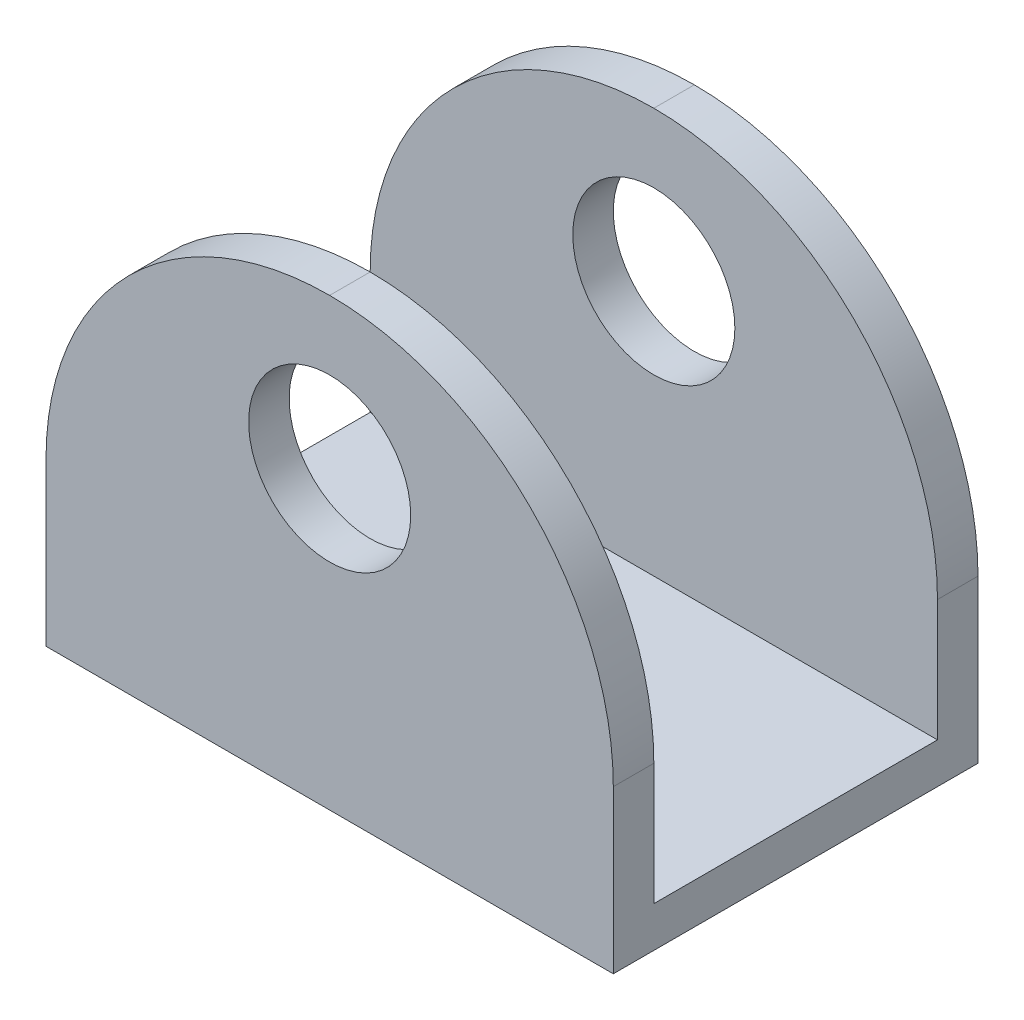
ISO-10303-21;
HEADER;
FILE_DESCRIPTION(('STEP AP214'),'2;1');
FILE_NAME('part.step','',(''),(''),'','','');
FILE_SCHEMA(('AUTOMOTIVE_DESIGN { 1 0 10303 214 1 1 1 1 }'));
ENDSEC;
DATA;
#1=APPLICATION_CONTEXT('core data for automotive mechanical design processes');
#2=APPLICATION_PROTOCOL_DEFINITION('international standard','automotive_design',2000,#1);
#3=PRODUCT_CONTEXT('',#1,'mechanical');
#4=PRODUCT('Part','Part','',(#3));
#5=PRODUCT_RELATED_PRODUCT_CATEGORY('part','',(#4));
#6=PRODUCT_DEFINITION_FORMATION('','',#4);
#7=PRODUCT_DEFINITION_CONTEXT('part definition',#1,'design');
#8=PRODUCT_DEFINITION('design','',#6,#7);
#9=PRODUCT_DEFINITION_SHAPE('','',#8);
#10=(LENGTH_UNIT() NAMED_UNIT(*) SI_UNIT(.MILLI.,.METRE.));
#11=(NAMED_UNIT(*) PLANE_ANGLE_UNIT() SI_UNIT($,.RADIAN.));
#12=(NAMED_UNIT(*) SI_UNIT($,.STERADIAN.) SOLID_ANGLE_UNIT());
#13=UNCERTAINTY_MEASURE_WITH_UNIT(LENGTH_MEASURE(1.E-05),#10,'distance_accuracy_value','');
#14=(GEOMETRIC_REPRESENTATION_CONTEXT(3) GLOBAL_UNCERTAINTY_ASSIGNED_CONTEXT((#13)) GLOBAL_UNIT_ASSIGNED_CONTEXT((#10,
#11,#12)) REPRESENTATION_CONTEXT('',''));
#15=CARTESIAN_POINT('',(0.,0.,0.));
#16=DIRECTION('',(0.,0.,1.));
#17=DIRECTION('',(1.,0.,0.));
#18=AXIS2_PLACEMENT_3D('',#15,#16,#17);
#19=CARTESIAN_POINT('',(0.,10.,0.));
#20=DIRECTION('',(0.,1.,0.));
#21=DIRECTION('',(0.,0.,1.));
#22=AXIS2_PLACEMENT_3D('',#19,#20,#21);
#23=PLANE('',#22);
#24=DIRECTION('',(0.,0.,-1.));
#25=VECTOR('',#24,1.);
#26=CARTESIAN_POINT('',(70.,10.,-45.));
#27=LINE('',#26,#25);
#28=CARTESIAN_POINT('',(70.,10.,35.));
#29=VERTEX_POINT('',#28);
#30=CARTESIAN_POINT('',(70.,10.,-35.));
#31=VERTEX_POINT('',#30);
#32=EDGE_CURVE('E117',#29,#31,#27,.T.);
#33=ORIENTED_EDGE('',*,*,#32,.T.);
#34=DIRECTION('',(1.,0.,0.));
#35=VECTOR('',#34,1.);
#36=CARTESIAN_POINT('',(70.,10.,-35.));
#37=LINE('',#36,#35);
#38=CARTESIAN_POINT('',(-70.,10.,-35.));
#39=VERTEX_POINT('',#38);
#40=EDGE_CURVE('E122',#39,#31,#37,.T.);
#41=ORIENTED_EDGE('',*,*,#40,.F.);
#42=DIRECTION('',(0.,0.,1.));
#43=VECTOR('',#42,1.);
#44=CARTESIAN_POINT('',(-70.,10.,-45.));
#45=LINE('',#44,#43);
#46=CARTESIAN_POINT('',(-70.,10.,35.));
#47=VERTEX_POINT('',#46);
#48=EDGE_CURVE('E135',#39,#47,#45,.T.);
#49=ORIENTED_EDGE('',*,*,#48,.T.);
#50=DIRECTION('',(-1.,0.,0.));
#51=VECTOR('',#50,1.);
#52=CARTESIAN_POINT('',(70.,10.,35.));
#53=LINE('',#52,#51);
#54=EDGE_CURVE('E134',#29,#47,#53,.T.);
#55=ORIENTED_EDGE('',*,*,#54,.F.);
#56=EDGE_LOOP('',(#33,#41,#49,#55));
#57=FACE_BOUND('',#56,.T.);
#58=ADVANCED_FACE('F34',(#57),#23,.T.);
#59=CARTESIAN_POINT('',(70.,10.,-45.));
#60=DIRECTION('',(-1.,0.,0.));
#61=DIRECTION('',(0.,0.,1.));
#62=AXIS2_PLACEMENT_3D('',#59,#60,#61);
#63=PLANE('',#62);
#64=DIRECTION('',(0.,-1.,0.));
#65=VECTOR('',#64,1.);
#66=CARTESIAN_POINT('',(70.,110.,35.));
#67=LINE('',#66,#65);
#68=CARTESIAN_POINT('',(70.,40.,35.));
#69=VERTEX_POINT('',#68);
#70=EDGE_CURVE('E144',#69,#29,#67,.T.);
#71=ORIENTED_EDGE('',*,*,#70,.F.);
#72=DIRECTION('',(0.,0.,-1.));
#73=VECTOR('',#72,1.);
#74=CARTESIAN_POINT('',(70.,40.,45.));
#75=LINE('',#74,#73);
#76=CARTESIAN_POINT('',(70.,40.,45.));
#77=VERTEX_POINT('',#76);
#78=EDGE_CURVE('E176',#69,#77,#75,.F.);
#79=ORIENTED_EDGE('',*,*,#78,.T.);
#80=DIRECTION('',(0.,-1.,0.));
#81=VECTOR('',#80,1.);
#82=CARTESIAN_POINT('',(70.,10.,45.));
#83=LINE('',#82,#81);
#84=CARTESIAN_POINT('',(70.,0.,45.));
#85=VERTEX_POINT('',#84);
#86=EDGE_CURVE('E138',#77,#85,#83,.T.);
#87=ORIENTED_EDGE('',*,*,#86,.T.);
#88=DIRECTION('',(0.,0.,-1.));
#89=VECTOR('',#88,1.);
#90=CARTESIAN_POINT('',(70.,0.,-45.));
#91=LINE('',#90,#89);
#92=CARTESIAN_POINT('',(70.,0.,-45.));
#93=VERTEX_POINT('',#92);
#94=EDGE_CURVE('E147',#85,#93,#91,.T.);
#95=ORIENTED_EDGE('',*,*,#94,.T.);
#96=DIRECTION('',(0.,-1.,0.));
#97=VECTOR('',#96,1.);
#98=CARTESIAN_POINT('',(70.,10.,-45.));
#99=LINE('',#98,#97);
#100=CARTESIAN_POINT('',(70.,40.,-45.));
#101=VERTEX_POINT('',#100);
#102=EDGE_CURVE('E160',#101,#93,#99,.T.);
#103=ORIENTED_EDGE('',*,*,#102,.F.);
#104=DIRECTION('',(0.,0.,-1.));
#105=VECTOR('',#104,1.);
#106=CARTESIAN_POINT('',(70.,40.,-45.));
#107=LINE('',#106,#105);
#108=CARTESIAN_POINT('',(70.,40.,-35.));
#109=VERTEX_POINT('',#108);
#110=EDGE_CURVE('E120',#101,#109,#107,.F.);
#111=ORIENTED_EDGE('',*,*,#110,.T.);
#112=DIRECTION('',(0.,-1.,0.));
#113=VECTOR('',#112,1.);
#114=CARTESIAN_POINT('',(70.,110.,-35.));
#115=LINE('',#114,#113);
#116=EDGE_CURVE('E112',#109,#31,#115,.T.);
#117=ORIENTED_EDGE('',*,*,#116,.T.);
#118=ORIENTED_EDGE('',*,*,#32,.F.);
#119=EDGE_LOOP('',(#71,#79,#87,#95,#103,#111,#117,#118));
#120=FACE_BOUND('',#119,.T.);
#121=ADVANCED_FACE('F115',(#120),#63,.F.);
#122=CARTESIAN_POINT('',(-70.,10.,-45.));
#123=DIRECTION('',(0.,0.,1.));
#124=DIRECTION('',(1.,0.,0.));
#125=AXIS2_PLACEMENT_3D('',#122,#123,#124);
#126=PLANE('',#125);
#127=CARTESIAN_POINT('',(0.,73.,-45.));
#128=DIRECTION('',(0.,0.,1.));
#129=DIRECTION('',(1.,0.,0.));
#130=AXIS2_PLACEMENT_3D('',#127,#128,#129);
#131=CIRCLE('',#130,20.);
#132=CARTESIAN_POINT('',(20.,73.,-45.));
#133=VERTEX_POINT('',#132);
#134=EDGE_CURVE('E185',#133,#133,#131,.T.);
#135=ORIENTED_EDGE('',*,*,#134,.T.);
#136=EDGE_LOOP('',(#135));
#137=FACE_BOUND('',#136,.T.);
#138=CARTESIAN_POINT('',(0.,40.,-45.));
#139=DIRECTION('',(0.,0.,1.));
#140=DIRECTION('',(1.,0.,0.));
#141=AXIS2_PLACEMENT_3D('',#138,#139,#140);
#142=CIRCLE('',#141,70.);
#143=CARTESIAN_POINT('',(-70.,40.,-45.));
#144=VERTEX_POINT('',#143);
#145=CARTESIAN_POINT('',(0.,110.,-45.));
#146=VERTEX_POINT('',#145);
#147=EDGE_CURVE('E57',#144,#146,#142,.F.);
#148=ORIENTED_EDGE('',*,*,#147,.T.);
#149=CARTESIAN_POINT('',(0.,40.,-45.));
#150=DIRECTION('',(0.,0.,1.));
#151=DIRECTION('',(1.,0.,0.));
#152=AXIS2_PLACEMENT_3D('',#149,#150,#151);
#153=CIRCLE('',#152,70.);
#154=EDGE_CURVE('E179',#146,#101,#153,.F.);
#155=ORIENTED_EDGE('',*,*,#154,.T.);
#156=ORIENTED_EDGE('',*,*,#102,.T.);
#157=DIRECTION('',(-1.,0.,0.));
#158=VECTOR('',#157,1.);
#159=CARTESIAN_POINT('',(-70.,0.,-45.));
#160=LINE('',#159,#158);
#161=CARTESIAN_POINT('',(-70.,0.,-45.));
#162=VERTEX_POINT('',#161);
#163=EDGE_CURVE('E150',#93,#162,#160,.T.);
#164=ORIENTED_EDGE('',*,*,#163,.T.);
#165=DIRECTION('',(0.,-1.,0.));
#166=VECTOR('',#165,1.);
#167=CARTESIAN_POINT('',(-70.,10.,-45.));
#168=LINE('',#167,#166);
#169=EDGE_CURVE('E158',#144,#162,#168,.T.);
#170=ORIENTED_EDGE('',*,*,#169,.F.);
#171=EDGE_LOOP('',(#148,#155,#156,#164,#170));
#172=FACE_BOUND('',#171,.T.);
#173=ADVANCED_FACE('F220',(#137,#172),#126,.F.);
#174=CARTESIAN_POINT('',(-70.,10.,-45.));
#175=DIRECTION('',(1.,0.,0.));
#176=DIRECTION('',(0.,0.,-1.));
#177=AXIS2_PLACEMENT_3D('',#174,#175,#176);
#178=PLANE('',#177);
#179=DIRECTION('',(0.,-1.,0.));
#180=VECTOR('',#179,1.);
#181=CARTESIAN_POINT('',(-70.,10.,45.));
#182=LINE('',#181,#180);
#183=CARTESIAN_POINT('',(-70.,40.,45.));
#184=VERTEX_POINT('',#183);
#185=CARTESIAN_POINT('',(-70.,0.,45.));
#186=VERTEX_POINT('',#185);
#187=EDGE_CURVE('E156',#184,#186,#182,.T.);
#188=ORIENTED_EDGE('',*,*,#187,.F.);
#189=DIRECTION('',(0.,0.,1.));
#190=VECTOR('',#189,1.);
#191=CARTESIAN_POINT('',(-70.,40.,35.));
#192=LINE('',#191,#190);
#193=CARTESIAN_POINT('',(-70.,40.,35.));
#194=VERTEX_POINT('',#193);
#195=EDGE_CURVE('E168',#184,#194,#192,.F.);
#196=ORIENTED_EDGE('',*,*,#195,.T.);
#197=DIRECTION('',(0.,-1.,0.));
#198=VECTOR('',#197,1.);
#199=CARTESIAN_POINT('',(-70.,110.,35.));
#200=LINE('',#199,#198);
#201=EDGE_CURVE('E198',#194,#47,#200,.T.);
#202=ORIENTED_EDGE('',*,*,#201,.T.);
#203=ORIENTED_EDGE('',*,*,#48,.F.);
#204=DIRECTION('',(0.,-1.,0.));
#205=VECTOR('',#204,1.);
#206=CARTESIAN_POINT('',(-70.,110.,-35.));
#207=LINE('',#206,#205);
#208=CARTESIAN_POINT('',(-70.,40.,-35.));
#209=VERTEX_POINT('',#208);
#210=EDGE_CURVE('E121',#209,#39,#207,.T.);
#211=ORIENTED_EDGE('',*,*,#210,.F.);
#212=DIRECTION('',(0.,0.,1.));
#213=VECTOR('',#212,1.);
#214=CARTESIAN_POINT('',(-70.,40.,-45.));
#215=LINE('',#214,#213);
#216=EDGE_CURVE('E166',#209,#144,#215,.F.);
#217=ORIENTED_EDGE('',*,*,#216,.T.);
#218=ORIENTED_EDGE('',*,*,#169,.T.);
#219=DIRECTION('',(0.,0.,1.));
#220=VECTOR('',#219,1.);
#221=CARTESIAN_POINT('',(-70.,0.,-45.));
#222=LINE('',#221,#220);
#223=EDGE_CURVE('E141',#162,#186,#222,.T.);
#224=ORIENTED_EDGE('',*,*,#223,.T.);
#225=EDGE_LOOP('',(#188,#196,#202,#203,#211,#217,#218,#224));
#226=FACE_BOUND('',#225,.T.);
#227=ADVANCED_FACE('F247',(#226),#178,.F.);
#228=CARTESIAN_POINT('',(-70.,10.,45.));
#229=DIRECTION('',(0.,0.,-1.));
#230=DIRECTION('',(-1.,0.,0.));
#231=AXIS2_PLACEMENT_3D('',#228,#229,#230);
#232=PLANE('',#231);
#233=CARTESIAN_POINT('',(0.,73.,45.));
#234=DIRECTION('',(0.,0.,1.));
#235=DIRECTION('',(1.,0.,0.));
#236=AXIS2_PLACEMENT_3D('',#233,#234,#235);
#237=CIRCLE('',#236,20.);
#238=CARTESIAN_POINT('',(20.,73.,45.));
#239=VERTEX_POINT('',#238);
#240=EDGE_CURVE('E266',#239,#239,#237,.T.);
#241=ORIENTED_EDGE('',*,*,#240,.F.);
#242=EDGE_LOOP('',(#241));
#243=FACE_BOUND('',#242,.T.);
#244=CARTESIAN_POINT('',(0.,40.,45.));
#245=DIRECTION('',(0.,0.,-1.));
#246=DIRECTION('',(-1.,0.,0.));
#247=AXIS2_PLACEMENT_3D('',#244,#245,#246);
#248=CIRCLE('',#247,70.);
#249=CARTESIAN_POINT('',(0.,110.,45.));
#250=VERTEX_POINT('',#249);
#251=EDGE_CURVE('E162',#77,#250,#248,.F.);
#252=ORIENTED_EDGE('',*,*,#251,.T.);
#253=CARTESIAN_POINT('',(0.,40.,45.));
#254=DIRECTION('',(0.,0.,-1.));
#255=DIRECTION('',(-1.,0.,0.));
#256=AXIS2_PLACEMENT_3D('',#253,#254,#255);
#257=CIRCLE('',#256,70.);
#258=EDGE_CURVE('E164',#250,#184,#257,.F.);
#259=ORIENTED_EDGE('',*,*,#258,.T.);
#260=ORIENTED_EDGE('',*,*,#187,.T.);
#261=DIRECTION('',(1.,0.,0.));
#262=VECTOR('',#261,1.);
#263=CARTESIAN_POINT('',(-70.,0.,45.));
#264=LINE('',#263,#262);
#265=EDGE_CURVE('E136',#186,#85,#264,.T.);
#266=ORIENTED_EDGE('',*,*,#265,.T.);
#267=ORIENTED_EDGE('',*,*,#86,.F.);
#268=EDGE_LOOP('',(#252,#259,#260,#266,#267));
#269=FACE_BOUND('',#268,.T.);
#270=ADVANCED_FACE('F212',(#243,#269),#232,.F.);
#271=CARTESIAN_POINT('',(0.,0.,0.));
#272=DIRECTION('',(0.,1.,0.));
#273=DIRECTION('',(0.,0.,1.));
#274=AXIS2_PLACEMENT_3D('',#271,#272,#273);
#275=PLANE('',#274);
#276=ORIENTED_EDGE('',*,*,#94,.F.);
#277=ORIENTED_EDGE('',*,*,#265,.F.);
#278=ORIENTED_EDGE('',*,*,#223,.F.);
#279=ORIENTED_EDGE('',*,*,#163,.F.);
#280=EDGE_LOOP('',(#276,#277,#278,#279));
#281=FACE_BOUND('',#280,.T.);
#282=ADVANCED_FACE('F218',(#281),#275,.F.);
#283=CARTESIAN_POINT('',(70.,110.,35.));
#284=DIRECTION('',(0.,0.,1.));
#285=DIRECTION('',(1.,0.,0.));
#286=AXIS2_PLACEMENT_3D('',#283,#284,#285);
#287=PLANE('',#286);
#288=CARTESIAN_POINT('',(0.,73.,35.));
#289=DIRECTION('',(0.,0.,1.));
#290=DIRECTION('',(1.,0.,0.));
#291=AXIS2_PLACEMENT_3D('',#288,#289,#290);
#292=CIRCLE('',#291,20.);
#293=CARTESIAN_POINT('',(20.,73.,35.));
#294=VERTEX_POINT('',#293);
#295=EDGE_CURVE('E189',#294,#294,#292,.T.);
#296=ORIENTED_EDGE('',*,*,#295,.T.);
#297=EDGE_LOOP('',(#296));
#298=FACE_BOUND('',#297,.T.);
#299=ORIENTED_EDGE('',*,*,#201,.F.);
#300=CARTESIAN_POINT('',(0.,40.,35.));
#301=DIRECTION('',(0.,0.,1.));
#302=DIRECTION('',(1.,0.,0.));
#303=AXIS2_PLACEMENT_3D('',#300,#301,#302);
#304=CIRCLE('',#303,70.);
#305=CARTESIAN_POINT('',(0.,110.,35.));
#306=VERTEX_POINT('',#305);
#307=EDGE_CURVE('E173',#194,#306,#304,.F.);
#308=ORIENTED_EDGE('',*,*,#307,.T.);
#309=CARTESIAN_POINT('',(0.,40.,35.));
#310=DIRECTION('',(0.,0.,1.));
#311=DIRECTION('',(1.,0.,0.));
#312=AXIS2_PLACEMENT_3D('',#309,#310,#311);
#313=CIRCLE('',#312,70.);
#314=EDGE_CURVE('E171',#306,#69,#313,.F.);
#315=ORIENTED_EDGE('',*,*,#314,.T.);
#316=ORIENTED_EDGE('',*,*,#70,.T.);
#317=ORIENTED_EDGE('',*,*,#54,.T.);
#318=EDGE_LOOP('',(#299,#308,#315,#316,#317));
#319=FACE_BOUND('',#318,.T.);
#320=ADVANCED_FACE('F202',(#298,#319),#287,.F.);
#321=CARTESIAN_POINT('',(70.,110.,-35.));
#322=DIRECTION('',(0.,0.,-1.));
#323=DIRECTION('',(-1.,0.,0.));
#324=AXIS2_PLACEMENT_3D('',#321,#322,#323);
#325=PLANE('',#324);
#326=CARTESIAN_POINT('',(0.,73.,-35.));
#327=DIRECTION('',(0.,0.,-1.));
#328=DIRECTION('',(-1.,0.,0.));
#329=AXIS2_PLACEMENT_3D('',#326,#327,#328);
#330=CIRCLE('',#329,20.);
#331=CARTESIAN_POINT('',(-20.,73.,-35.));
#332=VERTEX_POINT('',#331);
#333=EDGE_CURVE('E38',#332,#332,#330,.T.);
#334=ORIENTED_EDGE('',*,*,#333,.T.);
#335=EDGE_LOOP('',(#334));
#336=FACE_BOUND('',#335,.T.);
#337=ORIENTED_EDGE('',*,*,#116,.F.);
#338=CARTESIAN_POINT('',(0.,40.,-35.));
#339=DIRECTION('',(0.,0.,-1.));
#340=DIRECTION('',(-1.,0.,0.));
#341=AXIS2_PLACEMENT_3D('',#338,#339,#340);
#342=CIRCLE('',#341,70.);
#343=CARTESIAN_POINT('',(0.,110.,-35.));
#344=VERTEX_POINT('',#343);
#345=EDGE_CURVE('E11',#109,#344,#342,.F.);
#346=ORIENTED_EDGE('',*,*,#345,.T.);
#347=CARTESIAN_POINT('',(0.,40.,-35.));
#348=DIRECTION('',(0.,0.,-1.));
#349=DIRECTION('',(-1.,0.,0.));
#350=AXIS2_PLACEMENT_3D('',#347,#348,#349);
#351=CIRCLE('',#350,70.);
#352=EDGE_CURVE('E43',#344,#209,#351,.F.);
#353=ORIENTED_EDGE('',*,*,#352,.T.);
#354=ORIENTED_EDGE('',*,*,#210,.T.);
#355=ORIENTED_EDGE('',*,*,#40,.T.);
#356=EDGE_LOOP('',(#337,#346,#353,#354,#355));
#357=FACE_BOUND('',#356,.T.);
#358=ADVANCED_FACE('F125',(#336,#357),#325,.F.);
#359=CARTESIAN_POINT('',(0.,40.,0.));
#360=DIRECTION('',(0.,0.,1.));
#361=DIRECTION('',(1.,0.,0.));
#362=AXIS2_PLACEMENT_3D('',#359,#360,#361);
#363=CYLINDRICAL_SURFACE('',#362,70.);
#364=ORIENTED_EDGE('',*,*,#78,.F.);
#365=ORIENTED_EDGE('',*,*,#314,.F.);
#366=DIRECTION('',(0.,0.,-1.));
#367=VECTOR('',#366,1.);
#368=CARTESIAN_POINT('',(0.,110.,35.));
#369=LINE('',#368,#367);
#370=EDGE_CURVE('E130',#250,#306,#369,.T.);
#371=ORIENTED_EDGE('',*,*,#370,.F.);
#372=ORIENTED_EDGE('',*,*,#251,.F.);
#373=EDGE_LOOP('',(#364,#365,#371,#372));
#374=FACE_BOUND('',#373,.T.);
#375=ADVANCED_FACE('F208',(#374),#363,.T.);
#376=CARTESIAN_POINT('',(0.,40.,0.));
#377=DIRECTION('',(0.,0.,-1.));
#378=DIRECTION('',(-1.,0.,0.));
#379=AXIS2_PLACEMENT_3D('',#376,#377,#378);
#380=CYLINDRICAL_SURFACE('',#379,70.);
#381=ORIENTED_EDGE('',*,*,#307,.F.);
#382=ORIENTED_EDGE('',*,*,#195,.F.);
#383=ORIENTED_EDGE('',*,*,#258,.F.);
#384=ORIENTED_EDGE('',*,*,#370,.T.);
#385=EDGE_LOOP('',(#381,#382,#383,#384));
#386=FACE_BOUND('',#385,.T.);
#387=ADVANCED_FACE('F231',(#386),#380,.T.);
#388=CARTESIAN_POINT('',(0.,40.,0.));
#389=DIRECTION('',(0.,0.,1.));
#390=DIRECTION('',(1.,0.,0.));
#391=AXIS2_PLACEMENT_3D('',#388,#389,#390);
#392=CYLINDRICAL_SURFACE('',#391,70.);
#393=ORIENTED_EDGE('',*,*,#216,.F.);
#394=ORIENTED_EDGE('',*,*,#352,.F.);
#395=DIRECTION('',(0.,0.,1.));
#396=VECTOR('',#395,1.);
#397=CARTESIAN_POINT('',(0.,110.,0.));
#398=LINE('',#397,#396);
#399=EDGE_CURVE('E183',#146,#344,#398,.T.);
#400=ORIENTED_EDGE('',*,*,#399,.F.);
#401=ORIENTED_EDGE('',*,*,#147,.F.);
#402=EDGE_LOOP('',(#393,#394,#400,#401));
#403=FACE_BOUND('',#402,.T.);
#404=ADVANCED_FACE('F36',(#403),#392,.T.);
#405=CARTESIAN_POINT('',(0.,40.,0.));
#406=DIRECTION('',(0.,0.,-1.));
#407=DIRECTION('',(-1.,0.,0.));
#408=AXIS2_PLACEMENT_3D('',#405,#406,#407);
#409=CYLINDRICAL_SURFACE('',#408,70.);
#410=ORIENTED_EDGE('',*,*,#345,.F.);
#411=ORIENTED_EDGE('',*,*,#110,.F.);
#412=ORIENTED_EDGE('',*,*,#154,.F.);
#413=ORIENTED_EDGE('',*,*,#399,.T.);
#414=EDGE_LOOP('',(#410,#411,#412,#413));
#415=FACE_BOUND('',#414,.T.);
#416=ADVANCED_FACE('F221',(#415),#409,.T.);
#417=CARTESIAN_POINT('',(0.,73.,-55.));
#418=DIRECTION('',(0.,0.,1.));
#419=DIRECTION('',(1.,0.,0.));
#420=AXIS2_PLACEMENT_3D('',#417,#418,#419);
#421=CYLINDRICAL_SURFACE('',#420,20.);
#422=ORIENTED_EDGE('',*,*,#333,.F.);
#423=EDGE_LOOP('',(#422));
#424=FACE_BOUND('',#423,.T.);
#425=ORIENTED_EDGE('',*,*,#134,.F.);
#426=EDGE_LOOP('',(#425));
#427=FACE_BOUND('',#426,.T.);
#428=ADVANCED_FACE('F223',(#424,#427),#421,.F.);
#429=ORIENTED_EDGE('',*,*,#240,.T.);
#430=EDGE_LOOP('',(#429));
#431=FACE_BOUND('',#430,.T.);
#432=ORIENTED_EDGE('',*,*,#295,.F.);
#433=EDGE_LOOP('',(#432));
#434=FACE_BOUND('',#433,.T.);
#435=ADVANCED_FACE('F228',(#431,#434),#421,.F.);
#436=CLOSED_SHELL('',(#58,#121,#173,#227,#270,#282,#320,#358,#375,#387,#404,#416,#428,#435));
#437=MANIFOLD_SOLID_BREP('B2',#436);
#438=ADVANCED_BREP_SHAPE_REPRESENTATION('',(#18,#437),#14);
#439=SHAPE_DEFINITION_REPRESENTATION(#9,#438);
ENDSEC;
END-ISO-10303-21;
